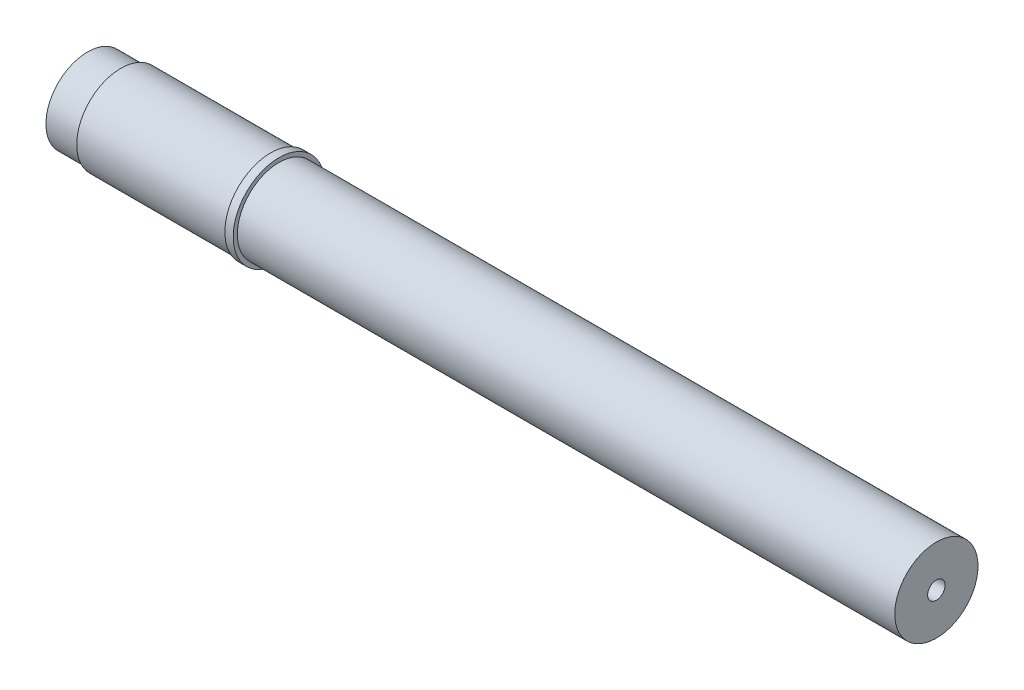
ISO-10303-21;
HEADER;
FILE_DESCRIPTION(('STEP AP214'),'2;1');
FILE_NAME('part.step','',(''),(''),'','','');
FILE_SCHEMA(('AUTOMOTIVE_DESIGN { 1 0 10303 214 1 1 1 1 }'));
ENDSEC;
DATA;
#1=APPLICATION_CONTEXT('core data for automotive mechanical design processes');
#2=APPLICATION_PROTOCOL_DEFINITION('international standard','automotive_design',2000,#1);
#3=PRODUCT_CONTEXT('',#1,'mechanical');
#4=PRODUCT('Part','Part','',(#3));
#5=PRODUCT_RELATED_PRODUCT_CATEGORY('part','',(#4));
#6=PRODUCT_DEFINITION_FORMATION('','',#4);
#7=PRODUCT_DEFINITION_CONTEXT('part definition',#1,'design');
#8=PRODUCT_DEFINITION('design','',#6,#7);
#9=PRODUCT_DEFINITION_SHAPE('','',#8);
#10=(LENGTH_UNIT() NAMED_UNIT(*) SI_UNIT(.MILLI.,.METRE.));
#11=(NAMED_UNIT(*) PLANE_ANGLE_UNIT() SI_UNIT($,.RADIAN.));
#12=(NAMED_UNIT(*) SI_UNIT($,.STERADIAN.) SOLID_ANGLE_UNIT());
#13=UNCERTAINTY_MEASURE_WITH_UNIT(LENGTH_MEASURE(1.E-05),#10,'distance_accuracy_value','');
#14=(GEOMETRIC_REPRESENTATION_CONTEXT(3) GLOBAL_UNCERTAINTY_ASSIGNED_CONTEXT((#13)) GLOBAL_UNIT_ASSIGNED_CONTEXT((#10,
#11,#12)) REPRESENTATION_CONTEXT('',''));
#15=CARTESIAN_POINT('',(0.,0.,0.));
#16=DIRECTION('',(0.,0.,1.));
#17=DIRECTION('',(1.,0.,0.));
#18=AXIS2_PLACEMENT_3D('',#15,#16,#17);
#19=CARTESIAN_POINT('',(-32.3439204095832,0.,0.));
#20=DIRECTION('',(1.,0.,0.));
#21=DIRECTION('',(0.,0.,-1.));
#22=AXIS2_PLACEMENT_3D('',#19,#20,#21);
#23=PLANE('',#22);
#24=CARTESIAN_POINT('',(-32.3439204095832,0.,0.));
#25=DIRECTION('',(1.,0.,0.));
#26=DIRECTION('',(0.,0.,-1.));
#27=AXIS2_PLACEMENT_3D('',#24,#25,#26);
#28=CIRCLE('',#27,25.);
#29=CARTESIAN_POINT('',(-32.3439204095832,0.,-25.0000000000001));
#30=VERTEX_POINT('',#29);
#31=EDGE_CURVE('E11',#30,#30,#28,.T.);
#32=ORIENTED_EDGE('',*,*,#31,.F.);
#33=EDGE_LOOP('',(#32));
#34=FACE_BOUND('',#33,.T.);
#35=ADVANCED_FACE('F43',(#34),#23,.F.);
#36=CARTESIAN_POINT('',(477.656079590417,0.,0.));
#37=DIRECTION('',(1.,0.,0.));
#38=DIRECTION('',(0.,0.,-1.));
#39=AXIS2_PLACEMENT_3D('',#36,#37,#38);
#40=CYLINDRICAL_SURFACE('',#39,25.);
#41=CARTESIAN_POINT('',(-12.3439204095832,0.,0.));
#42=DIRECTION('',(1.,0.,0.));
#43=DIRECTION('',(0.,0.,-1.));
#44=AXIS2_PLACEMENT_3D('',#41,#42,#43);
#45=CIRCLE('',#44,25.);
#46=CARTESIAN_POINT('',(-12.3439204095832,0.,-25.0000000000001));
#47=VERTEX_POINT('',#46);
#48=EDGE_CURVE('E50',#47,#47,#45,.T.);
#49=ORIENTED_EDGE('',*,*,#48,.F.);
#50=EDGE_LOOP('',(#49));
#51=FACE_BOUND('',#50,.T.);
#52=ORIENTED_EDGE('',*,*,#31,.T.);
#53=EDGE_LOOP('',(#52));
#54=FACE_BOUND('',#53,.T.);
#55=ADVANCED_FACE('F101',(#51,#54),#40,.T.);
#56=CARTESIAN_POINT('',(-12.3439204095832,-25.0000000000001,0.));
#57=DIRECTION('',(1.,0.,0.));
#58=DIRECTION('',(0.,0.,-1.));
#59=AXIS2_PLACEMENT_3D('',#56,#57,#58);
#60=PLANE('',#59);
#61=CARTESIAN_POINT('',(-12.3439204095832,0.,0.));
#62=DIRECTION('',(1.,0.,0.));
#63=DIRECTION('',(0.,0.,-1.));
#64=AXIS2_PLACEMENT_3D('',#61,#62,#63);
#65=CIRCLE('',#64,26.5);
#66=CARTESIAN_POINT('',(-12.3439204095832,0.,-26.5000000000001));
#67=VERTEX_POINT('',#66);
#68=EDGE_CURVE('E91',#67,#67,#65,.T.);
#69=ORIENTED_EDGE('',*,*,#68,.F.);
#70=EDGE_LOOP('',(#69));
#71=FACE_BOUND('',#70,.T.);
#72=ORIENTED_EDGE('',*,*,#48,.T.);
#73=EDGE_LOOP('',(#72));
#74=FACE_BOUND('',#73,.T.);
#75=ADVANCED_FACE('F99',(#71,#74),#60,.F.);
#76=CARTESIAN_POINT('',(477.656079590417,0.,0.));
#77=DIRECTION('',(1.,0.,0.));
#78=DIRECTION('',(0.,0.,-1.));
#79=AXIS2_PLACEMENT_3D('',#76,#77,#78);
#80=CYLINDRICAL_SURFACE('',#79,26.5);
#81=CARTESIAN_POINT('',(77.6560795904167,0.,0.));
#82=DIRECTION('',(1.,0.,0.));
#83=DIRECTION('',(0.,0.,-1.));
#84=AXIS2_PLACEMENT_3D('',#81,#82,#83);
#85=CIRCLE('',#84,26.5);
#86=CARTESIAN_POINT('',(77.6560795904167,0.,-26.5000000000001));
#87=VERTEX_POINT('',#86);
#88=EDGE_CURVE('E87',#87,#87,#85,.T.);
#89=ORIENTED_EDGE('',*,*,#88,.F.);
#90=EDGE_LOOP('',(#89));
#91=FACE_BOUND('',#90,.T.);
#92=ORIENTED_EDGE('',*,*,#68,.T.);
#93=EDGE_LOOP('',(#92));
#94=FACE_BOUND('',#93,.T.);
#95=ADVANCED_FACE('F119',(#91,#94),#80,.T.);
#96=CARTESIAN_POINT('',(77.6560795904169,-26.5000000000001,0.));
#97=DIRECTION('',(1.,0.,0.));
#98=DIRECTION('',(0.,0.,-1.));
#99=AXIS2_PLACEMENT_3D('',#96,#97,#98);
#100=PLANE('',#99);
#101=CARTESIAN_POINT('',(77.6560795904167,0.,0.));
#102=DIRECTION('',(1.,0.,0.));
#103=DIRECTION('',(0.,0.,-1.));
#104=AXIS2_PLACEMENT_3D('',#101,#102,#103);
#105=CIRCLE('',#104,27.5);
#106=CARTESIAN_POINT('',(77.6560795904167,0.,-27.5000000000001));
#107=VERTEX_POINT('',#106);
#108=EDGE_CURVE('E83',#107,#107,#105,.T.);
#109=ORIENTED_EDGE('',*,*,#108,.F.);
#110=EDGE_LOOP('',(#109));
#111=FACE_BOUND('',#110,.T.);
#112=ORIENTED_EDGE('',*,*,#88,.T.);
#113=EDGE_LOOP('',(#112));
#114=FACE_BOUND('',#113,.T.);
#115=ADVANCED_FACE('F127',(#111,#114),#100,.F.);
#116=CARTESIAN_POINT('',(477.656079590417,0.,0.));
#117=DIRECTION('',(1.,0.,0.));
#118=DIRECTION('',(0.,0.,-1.));
#119=AXIS2_PLACEMENT_3D('',#116,#117,#118);
#120=CYLINDRICAL_SURFACE('',#119,27.5);
#121=CARTESIAN_POINT('',(82.6560795904168,0.,0.));
#122=DIRECTION('',(1.,0.,0.));
#123=DIRECTION('',(0.,0.,-1.));
#124=AXIS2_PLACEMENT_3D('',#121,#122,#123);
#125=CIRCLE('',#124,27.5);
#126=CARTESIAN_POINT('',(82.6560795904168,0.,-27.5000000000001));
#127=VERTEX_POINT('',#126);
#128=EDGE_CURVE('E79',#127,#127,#125,.T.);
#129=ORIENTED_EDGE('',*,*,#128,.F.);
#130=EDGE_LOOP('',(#129));
#131=FACE_BOUND('',#130,.T.);
#132=ORIENTED_EDGE('',*,*,#108,.T.);
#133=EDGE_LOOP('',(#132));
#134=FACE_BOUND('',#133,.T.);
#135=ADVANCED_FACE('F135',(#131,#134),#120,.T.);
#136=CARTESIAN_POINT('',(82.6560795904168,-27.5000000000001,0.));
#137=DIRECTION('',(-1.,0.,0.));
#138=DIRECTION('',(0.,0.,1.));
#139=AXIS2_PLACEMENT_3D('',#136,#137,#138);
#140=PLANE('',#139);
#141=CARTESIAN_POINT('',(82.6560795904168,0.,0.));
#142=DIRECTION('',(1.,0.,0.));
#143=DIRECTION('',(0.,0.,-1.));
#144=AXIS2_PLACEMENT_3D('',#141,#142,#143);
#145=CIRCLE('',#144,25.);
#146=CARTESIAN_POINT('',(82.6560795904168,0.,-25.0000000000001));
#147=VERTEX_POINT('',#146);
#148=EDGE_CURVE('E71',#147,#147,#145,.T.);
#149=ORIENTED_EDGE('',*,*,#148,.F.);
#150=EDGE_LOOP('',(#149));
#151=FACE_BOUND('',#150,.T.);
#152=ORIENTED_EDGE('',*,*,#128,.T.);
#153=EDGE_LOOP('',(#152));
#154=FACE_BOUND('',#153,.T.);
#155=ADVANCED_FACE('F143',(#151,#154),#140,.F.);
#156=CARTESIAN_POINT('',(477.656079590417,0.,0.));
#157=DIRECTION('',(1.,0.,0.));
#158=DIRECTION('',(0.,0.,-1.));
#159=AXIS2_PLACEMENT_3D('',#156,#157,#158);
#160=CYLINDRICAL_SURFACE('',#159,25.);
#161=CARTESIAN_POINT('',(477.656079590417,0.,0.));
#162=DIRECTION('',(1.,0.,0.));
#163=DIRECTION('',(0.,0.,-1.));
#164=AXIS2_PLACEMENT_3D('',#161,#162,#163);
#165=CIRCLE('',#164,25.);
#166=CARTESIAN_POINT('',(477.656079590417,0.,-25.0000000000001));
#167=VERTEX_POINT('',#166);
#168=EDGE_CURVE('E64',#167,#167,#165,.T.);
#169=ORIENTED_EDGE('',*,*,#168,.F.);
#170=EDGE_LOOP('',(#169));
#171=FACE_BOUND('',#170,.T.);
#172=ORIENTED_EDGE('',*,*,#148,.T.);
#173=EDGE_LOOP('',(#172));
#174=FACE_BOUND('',#173,.T.);
#175=ADVANCED_FACE('F151',(#171,#174),#160,.T.);
#176=CARTESIAN_POINT('',(477.656079590417,-25.0000000000001,0.));
#177=DIRECTION('',(-1.,0.,0.));
#178=DIRECTION('',(0.,0.,1.));
#179=AXIS2_PLACEMENT_3D('',#176,#177,#178);
#180=PLANE('',#179);
#181=CARTESIAN_POINT('',(477.656079590417,0.,0.));
#182=DIRECTION('',(1.,0.,0.));
#183=DIRECTION('',(0.,0.,-1.));
#184=AXIS2_PLACEMENT_3D('',#181,#182,#183);
#185=CIRCLE('',#184,5.25);
#186=CARTESIAN_POINT('',(477.656079590417,0.,-5.25000000000001));
#187=VERTEX_POINT('',#186);
#188=EDGE_CURVE('E65',#187,#187,#185,.T.);
#189=ORIENTED_EDGE('',*,*,#188,.F.);
#190=EDGE_LOOP('',(#189));
#191=FACE_BOUND('',#190,.T.);
#192=ORIENTED_EDGE('',*,*,#168,.T.);
#193=EDGE_LOOP('',(#192));
#194=FACE_BOUND('',#193,.T.);
#195=ADVANCED_FACE('F57',(#191,#194),#180,.F.);
#196=CARTESIAN_POINT('',(442.656079590417,0.,0.));
#197=DIRECTION('',(1.,0.,0.));
#198=DIRECTION('',(0.,0.,-1.));
#199=AXIS2_PLACEMENT_3D('',#196,#197,#198);
#200=CONICAL_SURFACE('',#199,5.24999999999999,1.02974425867666);
#201=CARTESIAN_POINT('',(439.501561340522,0.,0.));
#202=VERTEX_POINT('',#201);
#203=VERTEX_LOOP('',#202);
#204=FACE_BOUND('',#203,.T.);
#205=CARTESIAN_POINT('',(442.656079590417,0.,0.));
#206=DIRECTION('',(1.,0.,0.));
#207=DIRECTION('',(0.,0.,-1.));
#208=AXIS2_PLACEMENT_3D('',#205,#206,#207);
#209=CIRCLE('',#208,5.24999999999999);
#210=CARTESIAN_POINT('',(442.656079590417,0.,-5.25000000000001));
#211=VERTEX_POINT('',#210);
#212=EDGE_CURVE('E61',#211,#211,#209,.T.);
#213=ORIENTED_EDGE('',*,*,#212,.T.);
#214=EDGE_LOOP('',(#213));
#215=FACE_BOUND('',#214,.T.);
#216=ADVANCED_FACE('F53',(#204,#215),#200,.F.);
#217=CARTESIAN_POINT('',(477.656079590417,0.,0.));
#218=DIRECTION('',(1.,0.,0.));
#219=DIRECTION('',(0.,0.,-1.));
#220=AXIS2_PLACEMENT_3D('',#217,#218,#219);
#221=CYLINDRICAL_SURFACE('',#220,5.24999999999999);
#222=ORIENTED_EDGE('',*,*,#212,.F.);
#223=EDGE_LOOP('',(#222));
#224=FACE_BOUND('',#223,.T.);
#225=ORIENTED_EDGE('',*,*,#188,.T.);
#226=EDGE_LOOP('',(#225));
#227=FACE_BOUND('',#226,.T.);
#228=ADVANCED_FACE('F56',(#224,#227),#221,.F.);
#229=CLOSED_SHELL('',(#35,#55,#75,#95,#115,#135,#155,#175,#195,#216,#228));
#230=MANIFOLD_SOLID_BREP('B2',#229);
#231=ADVANCED_BREP_SHAPE_REPRESENTATION('',(#18,#230),#14);
#232=SHAPE_DEFINITION_REPRESENTATION(#9,#231);
ENDSEC;
END-ISO-10303-21;
